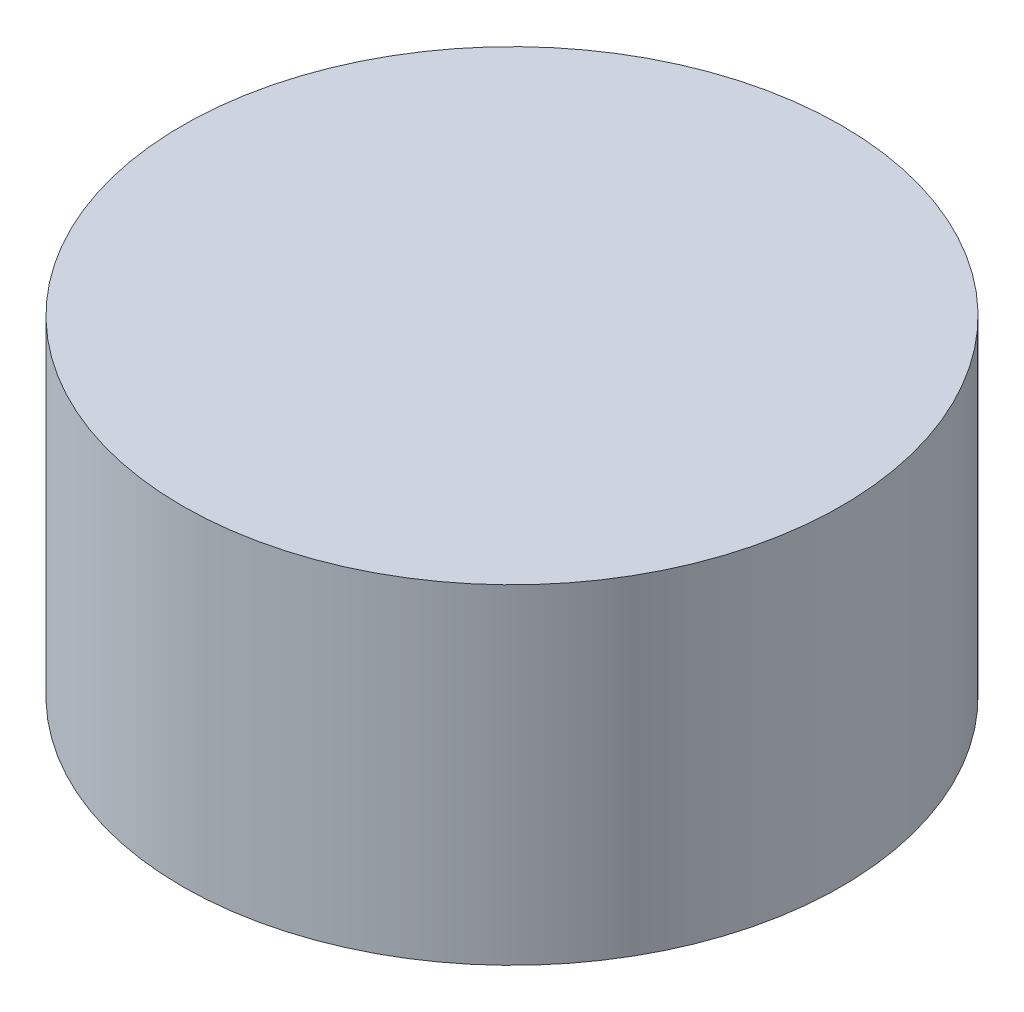
ISO-10303-21;
HEADER;
FILE_DESCRIPTION(('STEP AP214'),'2;1');
FILE_NAME('part.step','',(''),(''),'','','');
FILE_SCHEMA(('AUTOMOTIVE_DESIGN { 1 0 10303 214 1 1 1 1 }'));
ENDSEC;
DATA;
#1=APPLICATION_CONTEXT('core data for automotive mechanical design processes');
#2=APPLICATION_PROTOCOL_DEFINITION('international standard','automotive_design',2000,#1);
#3=PRODUCT_CONTEXT('',#1,'mechanical');
#4=PRODUCT('Part','Part','',(#3));
#5=PRODUCT_RELATED_PRODUCT_CATEGORY('part','',(#4));
#6=PRODUCT_DEFINITION_FORMATION('','',#4);
#7=PRODUCT_DEFINITION_CONTEXT('part definition',#1,'design');
#8=PRODUCT_DEFINITION('design','',#6,#7);
#9=PRODUCT_DEFINITION_SHAPE('','',#8);
#10=(LENGTH_UNIT() NAMED_UNIT(*) SI_UNIT(.MILLI.,.METRE.));
#11=(NAMED_UNIT(*) PLANE_ANGLE_UNIT() SI_UNIT($,.RADIAN.));
#12=(NAMED_UNIT(*) SI_UNIT($,.STERADIAN.) SOLID_ANGLE_UNIT());
#13=UNCERTAINTY_MEASURE_WITH_UNIT(LENGTH_MEASURE(1.E-05),#10,'distance_accuracy_value','');
#14=(GEOMETRIC_REPRESENTATION_CONTEXT(3) GLOBAL_UNCERTAINTY_ASSIGNED_CONTEXT((#13)) GLOBAL_UNIT_ASSIGNED_CONTEXT((#10,
#11,#12)) REPRESENTATION_CONTEXT('',''));
#15=CARTESIAN_POINT('',(0.,0.,0.));
#16=DIRECTION('',(0.,0.,1.));
#17=DIRECTION('',(1.,0.,0.));
#18=AXIS2_PLACEMENT_3D('',#15,#16,#17);
#19=CARTESIAN_POINT('',(0.,50.,0.));
#20=DIRECTION('',(0.,-1.,0.));
#21=DIRECTION('',(0.,0.,-1.));
#22=AXIS2_PLACEMENT_3D('',#19,#20,#21);
#23=CYLINDRICAL_SURFACE('',#22,50.);
#24=CARTESIAN_POINT('',(0.,50.,0.));
#25=DIRECTION('',(0.,1.,0.));
#26=DIRECTION('',(0.,0.,1.));
#27=AXIS2_PLACEMENT_3D('',#24,#25,#26);
#28=CIRCLE('',#27,50.);
#29=CARTESIAN_POINT('',(0.,50.,50.));
#30=VERTEX_POINT('',#29);
#31=EDGE_CURVE('E58',#30,#30,#28,.T.);
#32=ORIENTED_EDGE('',*,*,#31,.F.);
#33=EDGE_LOOP('',(#32));
#34=FACE_BOUND('',#33,.T.);
#35=CARTESIAN_POINT('',(0.,0.,0.));
#36=DIRECTION('',(0.,1.,0.));
#37=DIRECTION('',(0.,0.,1.));
#38=AXIS2_PLACEMENT_3D('',#35,#36,#37);
#39=CIRCLE('',#38,50.);
#40=CARTESIAN_POINT('',(0.,0.,50.));
#41=VERTEX_POINT('',#40);
#42=EDGE_CURVE('E60',#41,#41,#39,.T.);
#43=ORIENTED_EDGE('',*,*,#42,.T.);
#44=EDGE_LOOP('',(#43));
#45=FACE_BOUND('',#44,.T.);
#46=ADVANCED_FACE('F38',(#34,#45),#23,.T.);
#47=CARTESIAN_POINT('',(0.,50.,0.));
#48=DIRECTION('',(0.,1.,0.));
#49=DIRECTION('',(0.,0.,1.));
#50=AXIS2_PLACEMENT_3D('',#47,#48,#49);
#51=PLANE('',#50);
#52=ORIENTED_EDGE('',*,*,#31,.T.);
#53=EDGE_LOOP('',(#52));
#54=FACE_BOUND('',#53,.T.);
#55=ADVANCED_FACE('F83',(#54),#51,.T.);
#56=CARTESIAN_POINT('',(0.,0.,0.));
#57=DIRECTION('',(0.,1.,0.));
#58=DIRECTION('',(0.,0.,1.));
#59=AXIS2_PLACEMENT_3D('',#56,#57,#58);
#60=PLANE('',#59);
#61=CARTESIAN_POINT('',(0.,0.,0.));
#62=DIRECTION('',(0.,1.,0.));
#63=DIRECTION('',(0.,0.,1.));
#64=AXIS2_PLACEMENT_3D('',#61,#62,#63);
#65=CIRCLE('',#64,5.);
#66=CARTESIAN_POINT('',(0.,0.,5.));
#67=VERTEX_POINT('',#66);
#68=EDGE_CURVE('E10',#67,#67,#65,.F.);
#69=ORIENTED_EDGE('',*,*,#68,.F.);
#70=EDGE_LOOP('',(#69));
#71=FACE_BOUND('',#70,.T.);
#72=ORIENTED_EDGE('',*,*,#42,.F.);
#73=EDGE_LOOP('',(#72));
#74=FACE_BOUND('',#73,.T.);
#75=ADVANCED_FACE('F76',(#71,#74),#60,.F.);
#76=CARTESIAN_POINT('',(0.,-9.,0.));
#77=DIRECTION('',(0.,1.,0.));
#78=DIRECTION('',(0.,0.,1.));
#79=AXIS2_PLACEMENT_3D('',#76,#77,#78);
#80=CYLINDRICAL_SURFACE('',#79,5.);
#81=CARTESIAN_POINT('',(0.,-9.,0.));
#82=DIRECTION('',(0.,-1.,0.));
#83=DIRECTION('',(0.,0.,-1.));
#84=AXIS2_PLACEMENT_3D('',#81,#82,#83);
#85=CIRCLE('',#84,5.);
#86=CARTESIAN_POINT('',(0.,-9.,-5.));
#87=VERTEX_POINT('',#86);
#88=EDGE_CURVE('E64',#87,#87,#85,.T.);
#89=ORIENTED_EDGE('',*,*,#88,.F.);
#90=EDGE_LOOP('',(#89));
#91=FACE_BOUND('',#90,.T.);
#92=ORIENTED_EDGE('',*,*,#68,.T.);
#93=EDGE_LOOP('',(#92));
#94=FACE_BOUND('',#93,.T.);
#95=ADVANCED_FACE('F74',(#91,#94),#80,.T.);
#96=CARTESIAN_POINT('',(0.,-9.,0.));
#97=DIRECTION('',(0.,-1.,0.));
#98=DIRECTION('',(0.,0.,-1.));
#99=AXIS2_PLACEMENT_3D('',#96,#97,#98);
#100=PLANE('',#99);
#101=ORIENTED_EDGE('',*,*,#88,.T.);
#102=EDGE_LOOP('',(#101));
#103=FACE_BOUND('',#102,.T.);
#104=ADVANCED_FACE('F72',(#103),#100,.T.);
#105=CLOSED_SHELL('',(#46,#55,#75,#95,#104));
#106=CARTESIAN_POINT('',(0.,50.,0.));
#107=DIRECTION('',(0.,-1.,0.));
#108=DIRECTION('',(0.,0.,-1.));
#109=AXIS2_PLACEMENT_3D('',#106,#107,#108);
#110=CYLINDRICAL_SURFACE('',#109,40.);
#111=CARTESIAN_POINT('',(0.,40.,0.));
#112=DIRECTION('',(0.,1.,0.));
#113=DIRECTION('',(0.,0.,1.));
#114=AXIS2_PLACEMENT_3D('',#111,#112,#113);
#115=CIRCLE('',#114,40.);
#116=CARTESIAN_POINT('',(0.,40.,40.));
#117=VERTEX_POINT('',#116);
#118=EDGE_CURVE('E47',#117,#117,#115,.T.);
#119=ORIENTED_EDGE('',*,*,#118,.T.);
#120=EDGE_LOOP('',(#119));
#121=FACE_BOUND('',#120,.T.);
#122=CARTESIAN_POINT('',(0.,5.,0.));
#123=DIRECTION('',(0.,1.,0.));
#124=DIRECTION('',(0.,0.,1.));
#125=AXIS2_PLACEMENT_3D('',#122,#123,#124);
#126=CIRCLE('',#125,40.);
#127=CARTESIAN_POINT('',(0.,5.,40.));
#128=VERTEX_POINT('',#127);
#129=EDGE_CURVE('E52',#128,#128,#126,.T.);
#130=ORIENTED_EDGE('',*,*,#129,.F.);
#131=EDGE_LOOP('',(#130));
#132=FACE_BOUND('',#131,.T.);
#133=ADVANCED_FACE('F97',(#121,#132),#110,.F.);
#134=CARTESIAN_POINT('',(0.,40.,0.));
#135=DIRECTION('',(0.,1.,0.));
#136=DIRECTION('',(0.,0.,1.));
#137=AXIS2_PLACEMENT_3D('',#134,#135,#136);
#138=PLANE('',#137);
#139=ORIENTED_EDGE('',*,*,#118,.F.);
#140=EDGE_LOOP('',(#139));
#141=FACE_BOUND('',#140,.T.);
#142=ADVANCED_FACE('F99',(#141),#138,.F.);
#143=CARTESIAN_POINT('',(0.,5.,0.));
#144=DIRECTION('',(0.,1.,0.));
#145=DIRECTION('',(0.,0.,1.));
#146=AXIS2_PLACEMENT_3D('',#143,#144,#145);
#147=PLANE('',#146);
#148=ORIENTED_EDGE('',*,*,#129,.T.);
#149=EDGE_LOOP('',(#148));
#150=FACE_BOUND('',#149,.T.);
#151=ADVANCED_FACE('F40',(#150),#147,.T.);
#152=CLOSED_SHELL('',(#133,#142,#151));
#153=ORIENTED_CLOSED_SHELL('',*,#152,.T.);
#154=BREP_WITH_VOIDS('B2',#105,(#153));
#155=ADVANCED_BREP_SHAPE_REPRESENTATION('',(#18,#154),#14);
#156=SHAPE_DEFINITION_REPRESENTATION(#9,#155);
ENDSEC;
END-ISO-10303-21;
